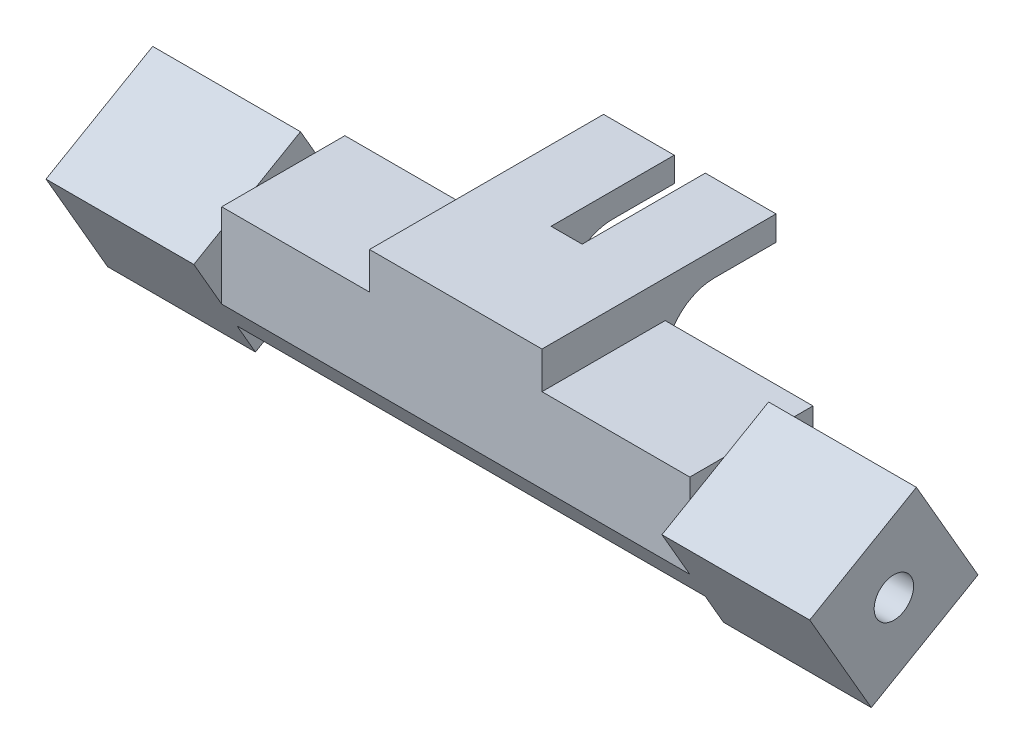
ISO-10303-21;
HEADER;
FILE_DESCRIPTION(('STEP AP214'),'2;1');
FILE_NAME('part.step','',(''),(''),'','','');
FILE_SCHEMA(('AUTOMOTIVE_DESIGN { 1 0 10303 214 1 1 1 1 }'));
ENDSEC;
DATA;
#1=APPLICATION_CONTEXT('core data for automotive mechanical design processes');
#2=APPLICATION_PROTOCOL_DEFINITION('international standard','automotive_design',2000,#1);
#3=PRODUCT_CONTEXT('',#1,'mechanical');
#4=PRODUCT('Part','Part','',(#3));
#5=PRODUCT_RELATED_PRODUCT_CATEGORY('part','',(#4));
#6=PRODUCT_DEFINITION_FORMATION('','',#4);
#7=PRODUCT_DEFINITION_CONTEXT('part definition',#1,'design');
#8=PRODUCT_DEFINITION('design','',#6,#7);
#9=PRODUCT_DEFINITION_SHAPE('','',#8);
#10=(LENGTH_UNIT() NAMED_UNIT(*) SI_UNIT(.MILLI.,.METRE.));
#11=(NAMED_UNIT(*) PLANE_ANGLE_UNIT() SI_UNIT($,.RADIAN.));
#12=(NAMED_UNIT(*) SI_UNIT($,.STERADIAN.) SOLID_ANGLE_UNIT());
#13=UNCERTAINTY_MEASURE_WITH_UNIT(LENGTH_MEASURE(1.E-05),#10,'distance_accuracy_value','');
#14=(GEOMETRIC_REPRESENTATION_CONTEXT(3) GLOBAL_UNCERTAINTY_ASSIGNED_CONTEXT((#13)) GLOBAL_UNIT_ASSIGNED_CONTEXT((#10,
#11,#12)) REPRESENTATION_CONTEXT('',''));
#15=CARTESIAN_POINT('',(0.,0.,0.));
#16=DIRECTION('',(0.,0.,1.));
#17=DIRECTION('',(1.,0.,0.));
#18=AXIS2_PLACEMENT_3D('',#15,#16,#17);
#19=CARTESIAN_POINT('',(9.5,-6.,0.));
#20=DIRECTION('',(-1.,0.,0.));
#21=DIRECTION('',(0.,0.,1.));
#22=AXIS2_PLACEMENT_3D('',#19,#20,#21);
#23=PLANE('',#22);
#24=DIRECTION('',(0.,-0.5,0.866025403784439));
#25=VECTOR('',#24,1.);
#26=CARTESIAN_POINT('',(9.5,-2.9599364905389,5.6315698604072));
#27=LINE('',#26,#25);
#28=CARTESIAN_POINT('',(9.5,-1.5,3.10288568297002));
#29=VERTEX_POINT('',#28);
#30=CARTESIAN_POINT('',(9.5,-2.30662432702594,4.5));
#31=VERTEX_POINT('',#30);
#32=EDGE_CURVE('E11',#29,#31,#27,.T.);
#33=ORIENTED_EDGE('',*,*,#32,.F.);
#34=DIRECTION('',(0.,0.,1.));
#35=VECTOR('',#34,1.);
#36=CARTESIAN_POINT('',(9.5,-1.5,0.));
#37=LINE('',#36,#35);
#38=CARTESIAN_POINT('',(9.5,-1.5,4.5));
#39=VERTEX_POINT('',#38);
#40=EDGE_CURVE('E352',#29,#39,#37,.T.);
#41=ORIENTED_EDGE('',*,*,#40,.T.);
#42=DIRECTION('',(0.,1.,0.));
#43=VECTOR('',#42,1.);
#44=CARTESIAN_POINT('',(9.5,-6.,4.5));
#45=LINE('',#44,#43);
#46=EDGE_CURVE('E58',#31,#39,#45,.T.);
#47=ORIENTED_EDGE('',*,*,#46,.F.);
#48=EDGE_LOOP('',(#33,#41,#47));
#49=FACE_BOUND('',#48,.T.);
#50=ADVANCED_FACE('F39',(#49),#23,.F.);
#51=DIRECTION('',(0.,0.866025403784439,0.5));
#52=VECTOR('',#51,1.);
#53=CARTESIAN_POINT('',(9.5,-0.459936490538902,1.30144284148501));
#54=LINE('',#53,#52);
#55=CARTESIAN_POINT('',(9.5,-3.58012701892219,-0.500000000000005));
#56=VERTEX_POINT('',#55);
#57=CARTESIAN_POINT('',(9.5,-1.5,0.700961894323335));
#58=VERTEX_POINT('',#57);
#59=EDGE_CURVE('E48',#56,#58,#54,.T.);
#60=ORIENTED_EDGE('',*,*,#59,.F.);
#61=DIRECTION('',(0.,1.,0.));
#62=VECTOR('',#61,1.);
#63=CARTESIAN_POINT('',(9.5,-6.,-0.500000000000002));
#64=LINE('',#63,#62);
#65=CARTESIAN_POINT('',(9.5,-1.5,-0.500000000000002));
#66=VERTEX_POINT('',#65);
#67=EDGE_CURVE('E372',#56,#66,#64,.T.);
#68=ORIENTED_EDGE('',*,*,#67,.T.);
#69=EDGE_CURVE('E353',#66,#58,#37,.T.);
#70=ORIENTED_EDGE('',*,*,#69,.T.);
#71=EDGE_LOOP('',(#60,#68,#70));
#72=FACE_BOUND('',#71,.T.);
#73=ADVANCED_FACE('F503',(#72),#23,.F.);
#74=CARTESIAN_POINT('',(-9.5,-6.,0.));
#75=DIRECTION('',(-1.,0.,0.));
#76=DIRECTION('',(0.,0.,1.));
#77=AXIS2_PLACEMENT_3D('',#74,#75,#76);
#78=PLANE('',#77);
#79=DIRECTION('',(0.,-0.866025403784439,-0.499999999999999));
#80=VECTOR('',#79,1.);
#81=CARTESIAN_POINT('',(-9.5,-4.79006350946111,-1.19855715851499));
#82=LINE('',#81,#80);
#83=CARTESIAN_POINT('',(-9.5,-1.5,0.700961894323343));
#84=VERTEX_POINT('',#83);
#85=CARTESIAN_POINT('',(-9.5,-3.5801270189222,-0.500000000000002));
#86=VERTEX_POINT('',#85);
#87=EDGE_CURVE('E291',#84,#86,#82,.T.);
#88=ORIENTED_EDGE('',*,*,#87,.F.);
#89=DIRECTION('',(0.,0.,1.));
#90=VECTOR('',#89,1.);
#91=CARTESIAN_POINT('',(-9.5,-1.5,0.));
#92=LINE('',#91,#90);
#93=CARTESIAN_POINT('',(-9.5,-1.5,-0.500000000000002));
#94=VERTEX_POINT('',#93);
#95=EDGE_CURVE('E336',#94,#84,#92,.T.);
#96=ORIENTED_EDGE('',*,*,#95,.F.);
#97=DIRECTION('',(0.,1.,0.));
#98=VECTOR('',#97,1.);
#99=CARTESIAN_POINT('',(-9.5,-6.,-0.500000000000002));
#100=LINE('',#99,#98);
#101=EDGE_CURVE('E264',#86,#94,#100,.T.);
#102=ORIENTED_EDGE('',*,*,#101,.F.);
#103=EDGE_LOOP('',(#88,#96,#102));
#104=FACE_BOUND('',#103,.T.);
#105=ADVANCED_FACE('F477',(#104),#78,.T.);
#106=DIRECTION('',(0.,0.499999999999999,-0.866025403784439));
#107=VECTOR('',#106,1.);
#108=CARTESIAN_POINT('',(-9.5,-0.459936490538908,1.30144284148501));
#109=LINE('',#108,#107);
#110=CARTESIAN_POINT('',(-9.5,-2.30662432702594,4.5));
#111=VERTEX_POINT('',#110);
#112=CARTESIAN_POINT('',(-9.5,-1.5,3.10288568297002));
#113=VERTEX_POINT('',#112);
#114=EDGE_CURVE('E286',#111,#113,#109,.T.);
#115=ORIENTED_EDGE('',*,*,#114,.F.);
#116=DIRECTION('',(0.,1.,0.));
#117=VECTOR('',#116,1.);
#118=CARTESIAN_POINT('',(-9.5,-6.,4.5));
#119=LINE('',#118,#117);
#120=CARTESIAN_POINT('',(-9.5,-1.5,4.5));
#121=VERTEX_POINT('',#120);
#122=EDGE_CURVE('E263',#111,#121,#119,.T.);
#123=ORIENTED_EDGE('',*,*,#122,.T.);
#124=EDGE_CURVE('E335',#113,#121,#92,.T.);
#125=ORIENTED_EDGE('',*,*,#124,.F.);
#126=EDGE_LOOP('',(#115,#123,#125));
#127=FACE_BOUND('',#126,.T.);
#128=ADVANCED_FACE('F448',(#127),#78,.T.);
#129=CARTESIAN_POINT('',(0.,-1.,-5.));
#130=DIRECTION('',(0.,0.,1.));
#131=DIRECTION('',(1.,0.,0.));
#132=AXIS2_PLACEMENT_3D('',#129,#130,#131);
#133=PLANE('',#132);
#134=DIRECTION('',(0.,1.,0.));
#135=VECTOR('',#134,1.);
#136=CARTESIAN_POINT('',(0.63,-1.3,-5.));
#137=LINE('',#136,#135);
#138=CARTESIAN_POINT('',(0.63,-1.,-5.));
#139=VERTEX_POINT('',#138);
#140=CARTESIAN_POINT('',(0.63,0.,-5.));
#141=VERTEX_POINT('',#140);
#142=EDGE_CURVE('E319',#139,#141,#137,.T.);
#143=ORIENTED_EDGE('',*,*,#142,.T.);
#144=DIRECTION('',(1.,0.,0.));
#145=VECTOR('',#144,1.);
#146=CARTESIAN_POINT('',(0.,0.,-5.));
#147=LINE('',#146,#145);
#148=CARTESIAN_POINT('',(3.5,0.,-5.));
#149=VERTEX_POINT('',#148);
#150=EDGE_CURVE('E383',#141,#149,#147,.T.);
#151=ORIENTED_EDGE('',*,*,#150,.T.);
#152=DIRECTION('',(0.,1.,0.));
#153=VECTOR('',#152,1.);
#154=CARTESIAN_POINT('',(3.5,-1.,-5.));
#155=LINE('',#154,#153);
#156=CARTESIAN_POINT('',(3.5,-1.,-5.));
#157=VERTEX_POINT('',#156);
#158=EDGE_CURVE('E405',#157,#149,#155,.T.);
#159=ORIENTED_EDGE('',*,*,#158,.F.);
#160=DIRECTION('',(1.,0.,0.));
#161=VECTOR('',#160,1.);
#162=CARTESIAN_POINT('',(0.,-1.,-5.));
#163=LINE('',#162,#161);
#164=EDGE_CURVE('E389',#139,#157,#163,.T.);
#165=ORIENTED_EDGE('',*,*,#164,.F.);
#166=EDGE_LOOP('',(#143,#151,#159,#165));
#167=FACE_BOUND('',#166,.T.);
#168=ADVANCED_FACE('F531',(#167),#133,.F.);
#169=CARTESIAN_POINT('',(0.,-1.,0.));
#170=DIRECTION('',(0.,1.,0.));
#171=DIRECTION('',(0.,0.,1.));
#172=AXIS2_PLACEMENT_3D('',#169,#170,#171);
#173=PLANE('',#172);
#174=DIRECTION('',(0.,0.,1.));
#175=VECTOR('',#174,1.);
#176=CARTESIAN_POINT('',(0.630000000000001,-1.,0.));
#177=LINE('',#176,#175);
#178=CARTESIAN_POINT('',(0.630000000000001,-1.,-2.5));
#179=VERTEX_POINT('',#178);
#180=EDGE_CURVE('E330',#139,#179,#177,.T.);
#181=ORIENTED_EDGE('',*,*,#180,.F.);
#182=ORIENTED_EDGE('',*,*,#164,.T.);
#183=DIRECTION('',(0.,0.,1.));
#184=VECTOR('',#183,1.);
#185=CARTESIAN_POINT('',(3.5,-1.,0.));
#186=LINE('',#185,#184);
#187=CARTESIAN_POINT('',(3.5,-1.,-2.5));
#188=VERTEX_POINT('',#187);
#189=EDGE_CURVE('E392',#157,#188,#186,.T.);
#190=ORIENTED_EDGE('',*,*,#189,.T.);
#191=DIRECTION('',(1.,0.,0.));
#192=VECTOR('',#191,1.);
#193=CARTESIAN_POINT('',(-3.5,-1.,-2.5));
#194=LINE('',#193,#192);
#195=EDGE_CURVE('E413',#188,#179,#194,.F.);
#196=ORIENTED_EDGE('',*,*,#195,.T.);
#197=EDGE_LOOP('',(#181,#182,#190,#196));
#198=FACE_BOUND('',#197,.T.);
#199=ADVANCED_FACE('F522',(#198),#173,.F.);
#200=CARTESIAN_POINT('',(0.,0.,0.));
#201=DIRECTION('',(0.,1.,0.));
#202=DIRECTION('',(0.,0.,1.));
#203=AXIS2_PLACEMENT_3D('',#200,#201,#202);
#204=PLANE('',#203);
#205=ORIENTED_EDGE('',*,*,#150,.F.);
#206=DIRECTION('',(0.,0.,1.));
#207=VECTOR('',#206,1.);
#208=CARTESIAN_POINT('',(0.630000000000001,0.,0.));
#209=LINE('',#208,#207);
#210=CARTESIAN_POINT('',(0.630000000000001,0.,0.));
#211=VERTEX_POINT('',#210);
#212=EDGE_CURVE('E306',#141,#211,#209,.T.);
#213=ORIENTED_EDGE('',*,*,#212,.T.);
#214=DIRECTION('',(-1.,0.,0.));
#215=VECTOR('',#214,1.);
#216=CARTESIAN_POINT('',(0.,0.,0.));
#217=LINE('',#216,#215);
#218=CARTESIAN_POINT('',(-0.63,0.,0.));
#219=VERTEX_POINT('',#218);
#220=EDGE_CURVE('E314',#211,#219,#217,.T.);
#221=ORIENTED_EDGE('',*,*,#220,.T.);
#222=DIRECTION('',(0.,0.,1.));
#223=VECTOR('',#222,1.);
#224=CARTESIAN_POINT('',(-0.63,0.,0.));
#225=LINE('',#224,#223);
#226=CARTESIAN_POINT('',(-0.630000000000001,0.,-5.));
#227=VERTEX_POINT('',#226);
#228=EDGE_CURVE('E302',#227,#219,#225,.T.);
#229=ORIENTED_EDGE('',*,*,#228,.F.);
#230=CARTESIAN_POINT('',(-3.5,0.,-5.));
#231=VERTEX_POINT('',#230);
#232=EDGE_CURVE('E396',#231,#227,#147,.T.);
#233=ORIENTED_EDGE('',*,*,#232,.F.);
#234=DIRECTION('',(0.,0.,1.));
#235=VECTOR('',#234,1.);
#236=CARTESIAN_POINT('',(-3.5,0.,0.));
#237=LINE('',#236,#235);
#238=CARTESIAN_POINT('',(-3.5,0.,4.5));
#239=VERTEX_POINT('',#238);
#240=EDGE_CURVE('E399',#231,#239,#237,.T.);
#241=ORIENTED_EDGE('',*,*,#240,.T.);
#242=DIRECTION('',(-1.,0.,0.));
#243=VECTOR('',#242,1.);
#244=CARTESIAN_POINT('',(0.,0.,4.5));
#245=LINE('',#244,#243);
#246=CARTESIAN_POINT('',(3.5,0.,4.5));
#247=VERTEX_POINT('',#246);
#248=EDGE_CURVE('E377',#247,#239,#245,.T.);
#249=ORIENTED_EDGE('',*,*,#248,.F.);
#250=DIRECTION('',(0.,0.,1.));
#251=VECTOR('',#250,1.);
#252=CARTESIAN_POINT('',(3.5,0.,0.));
#253=LINE('',#252,#251);
#254=EDGE_CURVE('E402',#149,#247,#253,.T.);
#255=ORIENTED_EDGE('',*,*,#254,.F.);
#256=EDGE_LOOP('',(#205,#213,#221,#229,#233,#241,#249,#255));
#257=FACE_BOUND('',#256,.T.);
#258=ADVANCED_FACE('F461',(#257),#204,.T.);
#259=CARTESIAN_POINT('',(0.,-3.,-2.5));
#260=DIRECTION('',(-1.,0.,0.));
#261=DIRECTION('',(0.,0.,1.));
#262=AXIS2_PLACEMENT_3D('',#259,#260,#261);
#263=CYLINDRICAL_SURFACE('',#262,2.);
#264=CARTESIAN_POINT('',(0.630000000000001,-3.,-2.5));
#265=DIRECTION('',(-1.,0.,0.));
#266=DIRECTION('',(0.,0.,1.));
#267=AXIS2_PLACEMENT_3D('',#264,#265,#266);
#268=CIRCLE('',#267,2.);
#269=CARTESIAN_POINT('',(0.630000000000001,-1.3,-1.44643462471473));
#270=VERTEX_POINT('',#269);
#271=EDGE_CURVE('E43',#179,#270,#268,.F.);
#272=ORIENTED_EDGE('',*,*,#271,.F.);
#273=ORIENTED_EDGE('',*,*,#195,.F.);
#274=CARTESIAN_POINT('',(3.5,-3.,-2.5));
#275=DIRECTION('',(-1.,0.,0.));
#276=DIRECTION('',(0.,0.,1.));
#277=AXIS2_PLACEMENT_3D('',#274,#275,#276);
#278=CIRCLE('',#277,2.);
#279=CARTESIAN_POINT('',(3.5,-3.,-0.5));
#280=VERTEX_POINT('',#279);
#281=EDGE_CURVE('E416',#280,#188,#278,.T.);
#282=ORIENTED_EDGE('',*,*,#281,.F.);
#283=DIRECTION('',(1.,0.,0.));
#284=VECTOR('',#283,1.);
#285=CARTESIAN_POINT('',(3.5,-3.,-0.5));
#286=LINE('',#285,#284);
#287=CARTESIAN_POINT('',(-3.5,-3.,-0.5));
#288=VERTEX_POINT('',#287);
#289=EDGE_CURVE('E408',#288,#280,#286,.T.);
#290=ORIENTED_EDGE('',*,*,#289,.F.);
#291=CARTESIAN_POINT('',(-3.5,-3.,-2.5));
#292=DIRECTION('',(-1.,0.,0.));
#293=DIRECTION('',(0.,0.,1.));
#294=AXIS2_PLACEMENT_3D('',#291,#292,#293);
#295=CIRCLE('',#294,2.);
#296=CARTESIAN_POINT('',(-3.5,-1.,-2.5));
#297=VERTEX_POINT('',#296);
#298=EDGE_CURVE('E418',#297,#288,#295,.F.);
#299=ORIENTED_EDGE('',*,*,#298,.F.);
#300=CARTESIAN_POINT('',(-0.630000000000001,-1.,-2.5));
#301=VERTEX_POINT('',#300);
#302=EDGE_CURVE('E412',#301,#297,#194,.F.);
#303=ORIENTED_EDGE('',*,*,#302,.F.);
#304=CARTESIAN_POINT('',(-0.630000000000001,-3.,-2.5));
#305=DIRECTION('',(-1.,0.,0.));
#306=DIRECTION('',(0.,0.,1.));
#307=AXIS2_PLACEMENT_3D('',#304,#305,#306);
#308=CIRCLE('',#307,2.);
#309=CARTESIAN_POINT('',(-0.630000000000001,-1.3,-1.44643462471473));
#310=VERTEX_POINT('',#309);
#311=EDGE_CURVE('E421',#301,#310,#308,.F.);
#312=ORIENTED_EDGE('',*,*,#311,.T.);
#313=DIRECTION('',(-1.,0.,0.));
#314=VECTOR('',#313,1.);
#315=CARTESIAN_POINT('',(0.,-1.3,-1.44643462471473));
#316=LINE('',#315,#314);
#317=EDGE_CURVE('E420',#270,#310,#316,.T.);
#318=ORIENTED_EDGE('',*,*,#317,.F.);
#319=EDGE_LOOP('',(#272,#273,#282,#290,#299,#303,#312,#318));
#320=FACE_BOUND('',#319,.T.);
#321=ADVANCED_FACE('F41',(#320),#263,.F.);
#322=ORIENTED_EDGE('',*,*,#232,.T.);
#323=DIRECTION('',(0.,1.,0.));
#324=VECTOR('',#323,1.);
#325=CARTESIAN_POINT('',(-0.630000000000001,-1.3,-5.));
#326=LINE('',#325,#324);
#327=CARTESIAN_POINT('',(-0.630000000000001,-1.,-5.));
#328=VERTEX_POINT('',#327);
#329=EDGE_CURVE('E311',#328,#227,#326,.T.);
#330=ORIENTED_EDGE('',*,*,#329,.F.);
#331=CARTESIAN_POINT('',(-3.5,-1.,-5.));
#332=VERTEX_POINT('',#331);
#333=EDGE_CURVE('E385',#332,#328,#163,.T.);
#334=ORIENTED_EDGE('',*,*,#333,.F.);
#335=DIRECTION('',(0.,1.,0.));
#336=VECTOR('',#335,1.);
#337=CARTESIAN_POINT('',(-3.5,-1.,-5.));
#338=LINE('',#337,#336);
#339=EDGE_CURVE('E395',#332,#231,#338,.T.);
#340=ORIENTED_EDGE('',*,*,#339,.T.);
#341=EDGE_LOOP('',(#322,#330,#334,#340));
#342=FACE_BOUND('',#341,.T.);
#343=ADVANCED_FACE('F466',(#342),#133,.F.);
#344=CARTESIAN_POINT('',(3.5,-1.,0.));
#345=DIRECTION('',(-1.,0.,0.));
#346=DIRECTION('',(0.,0.,1.));
#347=AXIS2_PLACEMENT_3D('',#344,#345,#346);
#348=PLANE('',#347);
#349=DIRECTION('',(0.,0.,1.));
#350=VECTOR('',#349,1.);
#351=CARTESIAN_POINT('',(3.5,-1.5,0.));
#352=LINE('',#351,#350);
#353=CARTESIAN_POINT('',(3.5,-1.5,-0.5));
#354=VERTEX_POINT('',#353);
#355=CARTESIAN_POINT('',(3.5,-1.5,4.5));
#356=VERTEX_POINT('',#355);
#357=EDGE_CURVE('E360',#354,#356,#352,.T.);
#358=ORIENTED_EDGE('',*,*,#357,.F.);
#359=DIRECTION('',(0.,-1.,0.));
#360=VECTOR('',#359,1.);
#361=CARTESIAN_POINT('',(3.5,-1.5,-0.5));
#362=LINE('',#361,#360);
#363=EDGE_CURVE('E362',#354,#280,#362,.T.);
#364=ORIENTED_EDGE('',*,*,#363,.T.);
#365=ORIENTED_EDGE('',*,*,#281,.T.);
#366=ORIENTED_EDGE('',*,*,#189,.F.);
#367=ORIENTED_EDGE('',*,*,#158,.T.);
#368=ORIENTED_EDGE('',*,*,#254,.T.);
#369=DIRECTION('',(0.,1.,0.));
#370=VECTOR('',#369,1.);
#371=CARTESIAN_POINT('',(3.5,-4.,4.5));
#372=LINE('',#371,#370);
#373=EDGE_CURVE('E381',#356,#247,#372,.T.);
#374=ORIENTED_EDGE('',*,*,#373,.F.);
#375=EDGE_LOOP('',(#358,#364,#365,#366,#367,#368,#374));
#376=FACE_BOUND('',#375,.T.);
#377=ADVANCED_FACE('F525',(#376),#348,.F.);
#378=CARTESIAN_POINT('',(-3.5,-1.,0.));
#379=DIRECTION('',(-1.,0.,0.));
#380=DIRECTION('',(0.,0.,1.));
#381=AXIS2_PLACEMENT_3D('',#378,#379,#380);
#382=PLANE('',#381);
#383=DIRECTION('',(0.,-1.,0.));
#384=VECTOR('',#383,1.);
#385=CARTESIAN_POINT('',(-3.5,-1.5,-0.5));
#386=LINE('',#385,#384);
#387=CARTESIAN_POINT('',(-3.5,-1.5,-0.500000000000002));
#388=VERTEX_POINT('',#387);
#389=EDGE_CURVE('E346',#388,#288,#386,.T.);
#390=ORIENTED_EDGE('',*,*,#389,.F.);
#391=DIRECTION('',(0.,0.,-1.));
#392=VECTOR('',#391,1.);
#393=CARTESIAN_POINT('',(-3.5,-1.5,0.));
#394=LINE('',#393,#392);
#395=CARTESIAN_POINT('',(-3.5,-1.5,4.5));
#396=VERTEX_POINT('',#395);
#397=EDGE_CURVE('E343',#396,#388,#394,.T.);
#398=ORIENTED_EDGE('',*,*,#397,.F.);
#399=DIRECTION('',(0.,1.,0.));
#400=VECTOR('',#399,1.);
#401=CARTESIAN_POINT('',(-3.5,-4.,4.5));
#402=LINE('',#401,#400);
#403=EDGE_CURVE('E380',#396,#239,#402,.T.);
#404=ORIENTED_EDGE('',*,*,#403,.T.);
#405=ORIENTED_EDGE('',*,*,#240,.F.);
#406=ORIENTED_EDGE('',*,*,#339,.F.);
#407=DIRECTION('',(0.,0.,1.));
#408=VECTOR('',#407,1.);
#409=CARTESIAN_POINT('',(-3.5,-1.,0.));
#410=LINE('',#409,#408);
#411=EDGE_CURVE('E388',#332,#297,#410,.T.);
#412=ORIENTED_EDGE('',*,*,#411,.T.);
#413=ORIENTED_EDGE('',*,*,#298,.T.);
#414=EDGE_LOOP('',(#390,#398,#404,#405,#406,#412,#413));
#415=FACE_BOUND('',#414,.T.);
#416=ADVANCED_FACE('F457',(#415),#382,.T.);
#417=ORIENTED_EDGE('',*,*,#333,.T.);
#418=DIRECTION('',(0.,0.,1.));
#419=VECTOR('',#418,1.);
#420=CARTESIAN_POINT('',(-0.63,-1.,0.));
#421=LINE('',#420,#419);
#422=EDGE_CURVE('E322',#328,#301,#421,.T.);
#423=ORIENTED_EDGE('',*,*,#422,.T.);
#424=ORIENTED_EDGE('',*,*,#302,.T.);
#425=ORIENTED_EDGE('',*,*,#411,.F.);
#426=EDGE_LOOP('',(#417,#423,#424,#425));
#427=FACE_BOUND('',#426,.T.);
#428=ADVANCED_FACE('F519',(#427),#173,.F.);
#429=CARTESIAN_POINT('',(0.,-4.,-0.5));
#430=DIRECTION('',(0.,0.,1.));
#431=DIRECTION('',(1.,0.,0.));
#432=AXIS2_PLACEMENT_3D('',#429,#430,#431);
#433=PLANE('',#432);
#434=CARTESIAN_POINT('',(9.5,-5.19337567297407,-0.500000000000002));
#435=VERTEX_POINT('',#434);
#436=EDGE_CURVE('E250',#435,#56,#64,.T.);
#437=ORIENTED_EDGE('',*,*,#436,.F.);
#438=DIRECTION('',(-1.,0.,0.));
#439=VECTOR('',#438,1.);
#440=CARTESIAN_POINT('',(15.5,-5.19337567297407,-0.500000000000002));
#441=LINE('',#440,#439);
#442=CARTESIAN_POINT('',(-9.5,-5.19337567297407,-0.500000000000002));
#443=VERTEX_POINT('',#442);
#444=EDGE_CURVE('E243',#435,#443,#441,.T.);
#445=ORIENTED_EDGE('',*,*,#444,.T.);
#446=EDGE_CURVE('E246',#443,#86,#100,.T.);
#447=ORIENTED_EDGE('',*,*,#446,.T.);
#448=ORIENTED_EDGE('',*,*,#101,.T.);
#449=DIRECTION('',(1.,0.,0.));
#450=VECTOR('',#449,1.);
#451=CARTESIAN_POINT('',(0.,-1.5,-0.500000000000002));
#452=LINE('',#451,#450);
#453=EDGE_CURVE('E339',#94,#388,#452,.T.);
#454=ORIENTED_EDGE('',*,*,#453,.T.);
#455=ORIENTED_EDGE('',*,*,#389,.T.);
#456=ORIENTED_EDGE('',*,*,#289,.T.);
#457=ORIENTED_EDGE('',*,*,#363,.F.);
#458=DIRECTION('',(1.,0.,0.));
#459=VECTOR('',#458,1.);
#460=CARTESIAN_POINT('',(0.,-1.5,-0.500000000000002));
#461=LINE('',#460,#459);
#462=EDGE_CURVE('E349',#354,#66,#461,.T.);
#463=ORIENTED_EDGE('',*,*,#462,.T.);
#464=ORIENTED_EDGE('',*,*,#67,.F.);
#465=EDGE_LOOP('',(#437,#445,#447,#448,#454,#455,#456,#457,#463,#464));
#466=FACE_BOUND('',#465,.T.);
#467=ADVANCED_FACE('F245',(#466),#433,.F.);
#468=CARTESIAN_POINT('',(0.,-4.,4.5));
#469=DIRECTION('',(0.,0.,-1.));
#470=DIRECTION('',(-1.,0.,0.));
#471=AXIS2_PLACEMENT_3D('',#468,#469,#470);
#472=PLANE('',#471);
#473=CARTESIAN_POINT('',(-9.5,-4.91987298107782,4.5));
#474=VERTEX_POINT('',#473);
#475=EDGE_CURVE('E376',#474,#111,#119,.T.);
#476=ORIENTED_EDGE('',*,*,#475,.F.);
#477=DIRECTION('',(-1.,0.,0.));
#478=VECTOR('',#477,1.);
#479=CARTESIAN_POINT('',(15.5,-4.91987298107782,4.5));
#480=LINE('',#479,#478);
#481=CARTESIAN_POINT('',(9.5,-4.91987298107782,4.5));
#482=VERTEX_POINT('',#481);
#483=EDGE_CURVE('E643',#482,#474,#480,.T.);
#484=ORIENTED_EDGE('',*,*,#483,.F.);
#485=EDGE_CURVE('E371',#482,#31,#45,.T.);
#486=ORIENTED_EDGE('',*,*,#485,.T.);
#487=ORIENTED_EDGE('',*,*,#46,.T.);
#488=DIRECTION('',(1.,0.,0.));
#489=VECTOR('',#488,1.);
#490=CARTESIAN_POINT('',(0.,-1.5,4.5));
#491=LINE('',#490,#489);
#492=EDGE_CURVE('E356',#356,#39,#491,.T.);
#493=ORIENTED_EDGE('',*,*,#492,.F.);
#494=ORIENTED_EDGE('',*,*,#373,.T.);
#495=ORIENTED_EDGE('',*,*,#248,.T.);
#496=ORIENTED_EDGE('',*,*,#403,.F.);
#497=DIRECTION('',(1.,0.,0.));
#498=VECTOR('',#497,1.);
#499=CARTESIAN_POINT('',(0.,-1.5,4.5));
#500=LINE('',#499,#498);
#501=EDGE_CURVE('E332',#121,#396,#500,.T.);
#502=ORIENTED_EDGE('',*,*,#501,.F.);
#503=ORIENTED_EDGE('',*,*,#122,.F.);
#504=EDGE_LOOP('',(#476,#484,#486,#487,#493,#494,#495,#496,#502,#503));
#505=FACE_BOUND('',#504,.T.);
#506=ADVANCED_FACE('F453',(#505),#472,.F.);
#507=CARTESIAN_POINT('',(0.,-6.,0.));
#508=DIRECTION('',(0.,-1.,0.));
#509=DIRECTION('',(0.,0.,-1.));
#510=AXIS2_PLACEMENT_3D('',#507,#508,#509);
#511=PLANE('',#510);
#512=DIRECTION('',(-1.,0.,0.));
#513=VECTOR('',#512,1.);
#514=CARTESIAN_POINT('',(15.5,-6.,0.897114317029961));
#515=LINE('',#514,#513);
#516=CARTESIAN_POINT('',(9.5,-6.,0.897114317029961));
#517=VERTEX_POINT('',#516);
#518=CARTESIAN_POINT('',(-9.5,-6.,0.897114317029961));
#519=VERTEX_POINT('',#518);
#520=EDGE_CURVE('E254',#517,#519,#515,.T.);
#521=ORIENTED_EDGE('',*,*,#520,.F.);
#522=DIRECTION('',(0.,0.,1.));
#523=VECTOR('',#522,1.);
#524=CARTESIAN_POINT('',(9.5,-6.,0.));
#525=LINE('',#524,#523);
#526=CARTESIAN_POINT('',(9.5,-6.,3.87638837486629));
#527=VERTEX_POINT('',#526);
#528=EDGE_CURVE('E367',#517,#527,#525,.T.);
#529=ORIENTED_EDGE('',*,*,#528,.T.);
#530=DIRECTION('',(-1.,0.,0.));
#531=VECTOR('',#530,1.);
#532=CARTESIAN_POINT('',(15.5,-6.,3.87638837486629));
#533=LINE('',#532,#531);
#534=CARTESIAN_POINT('',(-9.5,-6.,3.87638837486629));
#535=VERTEX_POINT('',#534);
#536=EDGE_CURVE('E255',#527,#535,#533,.T.);
#537=ORIENTED_EDGE('',*,*,#536,.T.);
#538=DIRECTION('',(0.,0.,1.));
#539=VECTOR('',#538,1.);
#540=CARTESIAN_POINT('',(-9.5,-6.,0.));
#541=LINE('',#540,#539);
#542=EDGE_CURVE('E364',#519,#535,#541,.T.);
#543=ORIENTED_EDGE('',*,*,#542,.F.);
#544=EDGE_LOOP('',(#521,#529,#537,#543));
#545=FACE_BOUND('',#544,.T.);
#546=ADVANCED_FACE('F511',(#545),#511,.T.);
#547=CARTESIAN_POINT('',(0.,-1.5,0.));
#548=DIRECTION('',(0.,-1.,0.));
#549=DIRECTION('',(0.,0.,-1.));
#550=AXIS2_PLACEMENT_3D('',#547,#548,#549);
#551=PLANE('',#550);
#552=ORIENTED_EDGE('',*,*,#462,.F.);
#553=ORIENTED_EDGE('',*,*,#357,.T.);
#554=ORIENTED_EDGE('',*,*,#492,.T.);
#555=ORIENTED_EDGE('',*,*,#40,.F.);
#556=EDGE_CURVE('E357',#58,#29,#37,.T.);
#557=ORIENTED_EDGE('',*,*,#556,.F.);
#558=ORIENTED_EDGE('',*,*,#69,.F.);
#559=EDGE_LOOP('',(#552,#553,#554,#555,#557,#558));
#560=FACE_BOUND('',#559,.T.);
#561=ADVANCED_FACE('F567',(#560),#551,.F.);
#562=CARTESIAN_POINT('',(0.,-1.5,0.));
#563=DIRECTION('',(0.,-1.,0.));
#564=DIRECTION('',(0.,0.,-1.));
#565=AXIS2_PLACEMENT_3D('',#562,#563,#564);
#566=PLANE('',#565);
#567=ORIENTED_EDGE('',*,*,#501,.T.);
#568=ORIENTED_EDGE('',*,*,#397,.T.);
#569=ORIENTED_EDGE('',*,*,#453,.F.);
#570=ORIENTED_EDGE('',*,*,#95,.T.);
#571=EDGE_CURVE('E340',#84,#113,#92,.T.);
#572=ORIENTED_EDGE('',*,*,#571,.T.);
#573=ORIENTED_EDGE('',*,*,#124,.T.);
#574=EDGE_LOOP('',(#567,#568,#569,#570,#572,#573));
#575=FACE_BOUND('',#574,.T.);
#576=ADVANCED_FACE('F444',(#575),#566,.F.);
#577=CARTESIAN_POINT('',(0.630000000000001,-1.3,0.));
#578=DIRECTION('',(-1.,0.,0.));
#579=DIRECTION('',(0.,0.,1.));
#580=AXIS2_PLACEMENT_3D('',#577,#578,#579);
#581=PLANE('',#580);
#582=ORIENTED_EDGE('',*,*,#180,.T.);
#583=ORIENTED_EDGE('',*,*,#271,.T.);
#584=DIRECTION('',(0.,0.,1.));
#585=VECTOR('',#584,1.);
#586=CARTESIAN_POINT('',(0.630000000000001,-1.3,0.));
#587=LINE('',#586,#585);
#588=CARTESIAN_POINT('',(0.630000000000001,-1.3,0.));
#589=VERTEX_POINT('',#588);
#590=EDGE_CURVE('E309',#270,#589,#587,.T.);
#591=ORIENTED_EDGE('',*,*,#590,.T.);
#592=DIRECTION('',(0.,1.,0.));
#593=VECTOR('',#592,1.);
#594=CARTESIAN_POINT('',(0.630000000000001,-1.3,0.));
#595=LINE('',#594,#593);
#596=EDGE_CURVE('E323',#589,#211,#595,.T.);
#597=ORIENTED_EDGE('',*,*,#596,.T.);
#598=ORIENTED_EDGE('',*,*,#212,.F.);
#599=ORIENTED_EDGE('',*,*,#142,.F.);
#600=EDGE_LOOP('',(#582,#583,#591,#597,#598,#599));
#601=FACE_BOUND('',#600,.T.);
#602=ADVANCED_FACE('F559',(#601),#581,.T.);
#603=CARTESIAN_POINT('',(-0.63,-1.3,0.));
#604=DIRECTION('',(-1.,0.,0.));
#605=DIRECTION('',(0.,0.,1.));
#606=AXIS2_PLACEMENT_3D('',#603,#604,#605);
#607=PLANE('',#606);
#608=ORIENTED_EDGE('',*,*,#329,.T.);
#609=ORIENTED_EDGE('',*,*,#228,.T.);
#610=DIRECTION('',(0.,1.,0.));
#611=VECTOR('',#610,1.);
#612=CARTESIAN_POINT('',(-0.63,-1.3,0.));
#613=LINE('',#612,#611);
#614=CARTESIAN_POINT('',(-0.63,-1.3,0.));
#615=VERTEX_POINT('',#614);
#616=EDGE_CURVE('E325',#615,#219,#613,.T.);
#617=ORIENTED_EDGE('',*,*,#616,.F.);
#618=DIRECTION('',(0.,0.,1.));
#619=VECTOR('',#618,1.);
#620=CARTESIAN_POINT('',(-0.63,-1.3,0.));
#621=LINE('',#620,#619);
#622=EDGE_CURVE('E303',#310,#615,#621,.T.);
#623=ORIENTED_EDGE('',*,*,#622,.F.);
#624=ORIENTED_EDGE('',*,*,#311,.F.);
#625=ORIENTED_EDGE('',*,*,#422,.F.);
#626=EDGE_LOOP('',(#608,#609,#617,#623,#624,#625));
#627=FACE_BOUND('',#626,.T.);
#628=ADVANCED_FACE('F554',(#627),#607,.F.);
#629=CARTESIAN_POINT('',(0.,-1.3,0.));
#630=DIRECTION('',(0.,1.,0.));
#631=DIRECTION('',(0.,0.,1.));
#632=AXIS2_PLACEMENT_3D('',#629,#630,#631);
#633=PLANE('',#632);
#634=ORIENTED_EDGE('',*,*,#317,.T.);
#635=ORIENTED_EDGE('',*,*,#622,.T.);
#636=DIRECTION('',(-1.,0.,0.));
#637=VECTOR('',#636,1.);
#638=CARTESIAN_POINT('',(0.,-1.3,0.));
#639=LINE('',#638,#637);
#640=EDGE_CURVE('E305',#589,#615,#639,.T.);
#641=ORIENTED_EDGE('',*,*,#640,.F.);
#642=ORIENTED_EDGE('',*,*,#590,.F.);
#643=EDGE_LOOP('',(#634,#635,#641,#642));
#644=FACE_BOUND('',#643,.T.);
#645=ADVANCED_FACE('F550',(#644),#633,.T.);
#646=CARTESIAN_POINT('',(0.,-1.3,0.));
#647=DIRECTION('',(0.,0.,-1.));
#648=DIRECTION('',(-1.,0.,0.));
#649=AXIS2_PLACEMENT_3D('',#646,#647,#648);
#650=PLANE('',#649);
#651=ORIENTED_EDGE('',*,*,#220,.F.);
#652=ORIENTED_EDGE('',*,*,#596,.F.);
#653=ORIENTED_EDGE('',*,*,#640,.T.);
#654=ORIENTED_EDGE('',*,*,#616,.T.);
#655=EDGE_LOOP('',(#651,#652,#653,#654));
#656=FACE_BOUND('',#655,.T.);
#657=ADVANCED_FACE('F557',(#656),#650,.T.);
#658=CARTESIAN_POINT('',(-9.5,0.,0.));
#659=DIRECTION('',(-1.,0.,0.));
#660=DIRECTION('',(0.,0.,1.));
#661=AXIS2_PLACEMENT_3D('',#658,#659,#660);
#662=PLANE('',#661);
#663=DIRECTION('',(0.,0.866025403784439,0.5));
#664=VECTOR('',#663,1.);
#665=CARTESIAN_POINT('',(-9.5,-7.29006350946111,3.13156986040721));
#666=LINE('',#665,#664);
#667=CARTESIAN_POINT('',(-9.5,-2.95993649053891,5.63156986040721));
#668=VERTEX_POINT('',#667);
#669=EDGE_CURVE('E271',#474,#668,#666,.T.);
#670=ORIENTED_EDGE('',*,*,#669,.F.);
#671=ORIENTED_EDGE('',*,*,#475,.T.);
#672=EDGE_CURVE('E283',#668,#111,#109,.T.);
#673=ORIENTED_EDGE('',*,*,#672,.F.);
#674=EDGE_LOOP('',(#670,#671,#673));
#675=FACE_BOUND('',#674,.T.);
#676=ADVANCED_FACE('F497',(#675),#662,.F.);
#677=ORIENTED_EDGE('',*,*,#571,.F.);
#678=CARTESIAN_POINT('',(-9.5,-0.459936490538908,1.30144284148501));
#679=VERTEX_POINT('',#678);
#680=EDGE_CURVE('E287',#679,#84,#82,.T.);
#681=ORIENTED_EDGE('',*,*,#680,.F.);
#682=EDGE_CURVE('E282',#113,#679,#109,.T.);
#683=ORIENTED_EDGE('',*,*,#682,.F.);
#684=EDGE_LOOP('',(#677,#681,#683));
#685=FACE_BOUND('',#684,.T.);
#686=ADVANCED_FACE('F441',(#685),#662,.F.);
#687=DIRECTION('',(0.,-0.5,0.866025403784439));
#688=VECTOR('',#687,1.);
#689=CARTESIAN_POINT('',(-9.5,-4.79006350946111,-1.19855715851499));
#690=LINE('',#689,#688);
#691=CARTESIAN_POINT('',(-9.5,-7.29006350946111,3.13156986040721));
#692=VERTEX_POINT('',#691);
#693=EDGE_CURVE('E272',#519,#692,#690,.T.);
#694=ORIENTED_EDGE('',*,*,#693,.F.);
#695=ORIENTED_EDGE('',*,*,#542,.T.);
#696=EDGE_CURVE('E274',#692,#535,#666,.T.);
#697=ORIENTED_EDGE('',*,*,#696,.F.);
#698=EDGE_LOOP('',(#694,#695,#697));
#699=FACE_BOUND('',#698,.T.);
#700=ADVANCED_FACE('F498',(#699),#662,.F.);
#701=CARTESIAN_POINT('',(-15.5,-4.79006350946111,-1.19855715851499));
#702=DIRECTION('',(0.,0.866025403784439,0.5));
#703=DIRECTION('',(0.,-0.5,0.866025403784439));
#704=AXIS2_PLACEMENT_3D('',#701,#702,#703);
#705=PLANE('',#704);
#706=CARTESIAN_POINT('',(-9.5,-4.79006350946111,-1.19855715851499));
#707=VERTEX_POINT('',#706);
#708=EDGE_CURVE('E260',#707,#443,#690,.T.);
#709=ORIENTED_EDGE('',*,*,#708,.T.);
#710=ORIENTED_EDGE('',*,*,#444,.F.);
#711=DIRECTION('',(0.,0.5,-0.866025403784439));
#712=VECTOR('',#711,1.);
#713=CARTESIAN_POINT('',(9.5,-7.2900635094611,3.1315698604072));
#714=LINE('',#713,#712);
#715=CARTESIAN_POINT('',(9.5,-4.7900635094611,-1.19855715851499));
#716=VERTEX_POINT('',#715);
#717=EDGE_CURVE('E631',#435,#716,#714,.T.);
#718=ORIENTED_EDGE('',*,*,#717,.T.);
#719=DIRECTION('',(-1.,0.,0.));
#720=VECTOR('',#719,1.);
#721=CARTESIAN_POINT('',(15.5,-4.7900635094611,-1.19855715851499));
#722=LINE('',#721,#720);
#723=CARTESIAN_POINT('',(15.5,-4.7900635094611,-1.19855715851499));
#724=VERTEX_POINT('',#723);
#725=EDGE_CURVE('E607',#724,#716,#722,.T.);
#726=ORIENTED_EDGE('',*,*,#725,.F.);
#727=DIRECTION('',(0.,0.5,-0.866025403784439));
#728=VECTOR('',#727,1.);
#729=CARTESIAN_POINT('',(15.5,-7.2900635094611,3.1315698604072));
#730=LINE('',#729,#728);
#731=CARTESIAN_POINT('',(15.5,-7.2900635094611,3.1315698604072));
#732=VERTEX_POINT('',#731);
#733=EDGE_CURVE('E597',#732,#724,#730,.T.);
#734=ORIENTED_EDGE('',*,*,#733,.F.);
#735=DIRECTION('',(-1.,0.,0.));
#736=VECTOR('',#735,1.);
#737=CARTESIAN_POINT('',(15.5,-7.2900635094611,3.1315698604072));
#738=LINE('',#737,#736);
#739=CARTESIAN_POINT('',(9.5,-7.2900635094611,3.1315698604072));
#740=VERTEX_POINT('',#739);
#741=EDGE_CURVE('E276',#732,#740,#738,.T.);
#742=ORIENTED_EDGE('',*,*,#741,.T.);
#743=EDGE_CURVE('E619',#740,#517,#714,.T.);
#744=ORIENTED_EDGE('',*,*,#743,.T.);
#745=ORIENTED_EDGE('',*,*,#520,.T.);
#746=ORIENTED_EDGE('',*,*,#693,.T.);
#747=DIRECTION('',(1.,0.,0.));
#748=VECTOR('',#747,1.);
#749=CARTESIAN_POINT('',(-15.5,-7.29006350946111,3.13156986040721));
#750=LINE('',#749,#748);
#751=CARTESIAN_POINT('',(-15.5,-7.29006350946111,3.13156986040721));
#752=VERTEX_POINT('',#751);
#753=EDGE_CURVE('E299',#752,#692,#750,.T.);
#754=ORIENTED_EDGE('',*,*,#753,.F.);
#755=DIRECTION('',(0.,-0.5,0.866025403784439));
#756=VECTOR('',#755,1.);
#757=CARTESIAN_POINT('',(-15.5,-4.79006350946111,-1.19855715851499));
#758=LINE('',#757,#756);
#759=CARTESIAN_POINT('',(-15.5,-4.79006350946111,-1.19855715851499));
#760=VERTEX_POINT('',#759);
#761=EDGE_CURVE('E290',#760,#752,#758,.T.);
#762=ORIENTED_EDGE('',*,*,#761,.F.);
#763=DIRECTION('',(1.,0.,0.));
#764=VECTOR('',#763,1.);
#765=CARTESIAN_POINT('',(-15.5,-4.79006350946111,-1.19855715851499));
#766=LINE('',#765,#764);
#767=EDGE_CURVE('E270',#760,#707,#766,.T.);
#768=ORIENTED_EDGE('',*,*,#767,.T.);
#769=EDGE_LOOP('',(#709,#710,#718,#726,#734,#742,#744,#745,#746,#754,#762,#768));
#770=FACE_BOUND('',#769,.T.);
#771=ADVANCED_FACE('F267',(#770),#705,.F.);
#772=CARTESIAN_POINT('',(-15.5,-7.29006350946111,3.13156986040721));
#773=DIRECTION('',(0.,0.5,-0.866025403784439));
#774=DIRECTION('',(0.,0.866025403784439,0.5));
#775=AXIS2_PLACEMENT_3D('',#772,#773,#774);
#776=PLANE('',#775);
#777=ORIENTED_EDGE('',*,*,#696,.T.);
#778=ORIENTED_EDGE('',*,*,#536,.F.);
#779=DIRECTION('',(0.,-0.866025403784439,-0.5));
#780=VECTOR('',#779,1.);
#781=CARTESIAN_POINT('',(9.5,-2.9599364905389,5.6315698604072));
#782=LINE('',#781,#780);
#783=EDGE_CURVE('E624',#527,#740,#782,.T.);
#784=ORIENTED_EDGE('',*,*,#783,.T.);
#785=ORIENTED_EDGE('',*,*,#741,.F.);
#786=DIRECTION('',(0.,-0.866025403784439,-0.5));
#787=VECTOR('',#786,1.);
#788=CARTESIAN_POINT('',(15.5,-2.9599364905389,5.6315698604072));
#789=LINE('',#788,#787);
#790=CARTESIAN_POINT('',(15.5,-2.9599364905389,5.6315698604072));
#791=VERTEX_POINT('',#790);
#792=EDGE_CURVE('E596',#791,#732,#789,.T.);
#793=ORIENTED_EDGE('',*,*,#792,.F.);
#794=DIRECTION('',(-1.,0.,0.));
#795=VECTOR('',#794,1.);
#796=CARTESIAN_POINT('',(15.5,-2.9599364905389,5.6315698604072));
#797=LINE('',#796,#795);
#798=CARTESIAN_POINT('',(9.5,-2.9599364905389,5.6315698604072));
#799=VERTEX_POINT('',#798);
#800=EDGE_CURVE('E603',#791,#799,#797,.T.);
#801=ORIENTED_EDGE('',*,*,#800,.T.);
#802=EDGE_CURVE('E627',#799,#482,#782,.T.);
#803=ORIENTED_EDGE('',*,*,#802,.T.);
#804=ORIENTED_EDGE('',*,*,#483,.T.);
#805=ORIENTED_EDGE('',*,*,#669,.T.);
#806=DIRECTION('',(1.,0.,0.));
#807=VECTOR('',#806,1.);
#808=CARTESIAN_POINT('',(-15.5,-2.95993649053891,5.63156986040721));
#809=LINE('',#808,#807);
#810=CARTESIAN_POINT('',(-15.5,-2.95993649053891,5.63156986040721));
#811=VERTEX_POINT('',#810);
#812=EDGE_CURVE('E296',#811,#668,#809,.T.);
#813=ORIENTED_EDGE('',*,*,#812,.F.);
#814=DIRECTION('',(0.,0.866025403784439,0.5));
#815=VECTOR('',#814,1.);
#816=CARTESIAN_POINT('',(-15.5,-7.29006350946111,3.13156986040721));
#817=LINE('',#816,#815);
#818=EDGE_CURVE('E481',#752,#811,#817,.T.);
#819=ORIENTED_EDGE('',*,*,#818,.F.);
#820=ORIENTED_EDGE('',*,*,#753,.T.);
#821=EDGE_LOOP('',(#777,#778,#784,#785,#793,#801,#803,#804,#805,#813,#819,#820));
#822=FACE_BOUND('',#821,.T.);
#823=ADVANCED_FACE('F622',(#822),#776,.F.);
#824=CARTESIAN_POINT('',(-15.5,-0.459936490538908,1.30144284148501));
#825=DIRECTION('',(0.,-0.866025403784439,-0.499999999999999));
#826=DIRECTION('',(0.,0.499999999999999,-0.866025403784439));
#827=AXIS2_PLACEMENT_3D('',#824,#825,#826);
#828=PLANE('',#827);
#829=ORIENTED_EDGE('',*,*,#672,.T.);
#830=ORIENTED_EDGE('',*,*,#114,.T.);
#831=ORIENTED_EDGE('',*,*,#682,.T.);
#832=DIRECTION('',(1.,0.,0.));
#833=VECTOR('',#832,1.);
#834=CARTESIAN_POINT('',(-15.5,-0.459936490538908,1.30144284148501));
#835=LINE('',#834,#833);
#836=CARTESIAN_POINT('',(-15.5,-0.459936490538908,1.30144284148501));
#837=VERTEX_POINT('',#836);
#838=EDGE_CURVE('E293',#837,#679,#835,.T.);
#839=ORIENTED_EDGE('',*,*,#838,.F.);
#840=DIRECTION('',(0.,0.499999999999999,-0.866025403784439));
#841=VECTOR('',#840,1.);
#842=CARTESIAN_POINT('',(-15.5,-0.459936490538908,1.30144284148501));
#843=LINE('',#842,#841);
#844=EDGE_CURVE('E483',#811,#837,#843,.T.);
#845=ORIENTED_EDGE('',*,*,#844,.F.);
#846=ORIENTED_EDGE('',*,*,#812,.T.);
#847=EDGE_LOOP('',(#829,#830,#831,#839,#845,#846));
#848=FACE_BOUND('',#847,.T.);
#849=ADVANCED_FACE('F433',(#848),#828,.F.);
#850=CARTESIAN_POINT('',(-15.5,-4.79006350946111,-1.19855715851499));
#851=DIRECTION('',(0.,-0.499999999999999,0.866025403784439));
#852=DIRECTION('',(0.,-0.866025403784439,-0.499999999999999));
#853=AXIS2_PLACEMENT_3D('',#850,#851,#852);
#854=PLANE('',#853);
#855=ORIENTED_EDGE('',*,*,#680,.T.);
#856=ORIENTED_EDGE('',*,*,#87,.T.);
#857=EDGE_CURVE('E261',#86,#707,#82,.T.);
#858=ORIENTED_EDGE('',*,*,#857,.T.);
#859=ORIENTED_EDGE('',*,*,#767,.F.);
#860=DIRECTION('',(0.,-0.866025403784439,-0.499999999999999));
#861=VECTOR('',#860,1.);
#862=CARTESIAN_POINT('',(-15.5,-4.79006350946111,-1.19855715851499));
#863=LINE('',#862,#861);
#864=EDGE_CURVE('E278',#837,#760,#863,.T.);
#865=ORIENTED_EDGE('',*,*,#864,.F.);
#866=ORIENTED_EDGE('',*,*,#838,.T.);
#867=EDGE_LOOP('',(#855,#856,#858,#859,#865,#866));
#868=FACE_BOUND('',#867,.T.);
#869=ADVANCED_FACE('F440',(#868),#854,.F.);
#870=CARTESIAN_POINT('',(-15.5,0.,0.));
#871=DIRECTION('',(-1.,0.,0.));
#872=DIRECTION('',(0.,0.,1.));
#873=AXIS2_PLACEMENT_3D('',#870,#871,#872);
#874=PLANE('',#873);
#875=CARTESIAN_POINT('',(-15.5,-3.87500000000001,2.21650635094611));
#876=DIRECTION('',(-1.,0.,0.));
#877=DIRECTION('',(0.,0.,1.));
#878=AXIS2_PLACEMENT_3D('',#875,#876,#877);
#879=CIRCLE('',#878,0.8);
#880=CARTESIAN_POINT('',(-15.5,-3.87500000000001,3.01650635094611));
#881=VERTEX_POINT('',#880);
#882=EDGE_CURVE('E638',#881,#881,#879,.T.);
#883=ORIENTED_EDGE('',*,*,#882,.F.);
#884=EDGE_LOOP('',(#883));
#885=FACE_BOUND('',#884,.T.);
#886=ORIENTED_EDGE('',*,*,#761,.T.);
#887=ORIENTED_EDGE('',*,*,#818,.T.);
#888=ORIENTED_EDGE('',*,*,#844,.T.);
#889=ORIENTED_EDGE('',*,*,#864,.T.);
#890=EDGE_LOOP('',(#886,#887,#888,#889));
#891=FACE_BOUND('',#890,.T.);
#892=ADVANCED_FACE('F487',(#885,#891),#874,.T.);
#893=ORIENTED_EDGE('',*,*,#446,.F.);
#894=ORIENTED_EDGE('',*,*,#708,.F.);
#895=ORIENTED_EDGE('',*,*,#857,.F.);
#896=EDGE_LOOP('',(#893,#894,#895));
#897=FACE_BOUND('',#896,.T.);
#898=ADVANCED_FACE('F259',(#897),#662,.F.);
#899=CARTESIAN_POINT('',(9.5,0.,0.));
#900=DIRECTION('',(1.,0.,0.));
#901=DIRECTION('',(0.,0.,-1.));
#902=AXIS2_PLACEMENT_3D('',#899,#900,#901);
#903=PLANE('',#902);
#904=ORIENTED_EDGE('',*,*,#717,.F.);
#905=ORIENTED_EDGE('',*,*,#436,.T.);
#906=EDGE_CURVE('E599',#716,#56,#54,.T.);
#907=ORIENTED_EDGE('',*,*,#906,.F.);
#908=EDGE_LOOP('',(#904,#905,#907));
#909=FACE_BOUND('',#908,.T.);
#910=ADVANCED_FACE('F495',(#909),#903,.F.);
#911=CARTESIAN_POINT('',(9.5,-0.459936490538902,1.30144284148501));
#912=VERTEX_POINT('',#911);
#913=EDGE_CURVE('E588',#58,#912,#54,.T.);
#914=ORIENTED_EDGE('',*,*,#913,.F.);
#915=ORIENTED_EDGE('',*,*,#556,.T.);
#916=EDGE_CURVE('E50',#912,#29,#27,.T.);
#917=ORIENTED_EDGE('',*,*,#916,.F.);
#918=EDGE_LOOP('',(#914,#915,#917));
#919=FACE_BOUND('',#918,.T.);
#920=ADVANCED_FACE('F587',(#919),#903,.F.);
#921=ORIENTED_EDGE('',*,*,#485,.F.);
#922=ORIENTED_EDGE('',*,*,#802,.F.);
#923=EDGE_CURVE('E51',#31,#799,#27,.T.);
#924=ORIENTED_EDGE('',*,*,#923,.F.);
#925=EDGE_LOOP('',(#921,#922,#924));
#926=FACE_BOUND('',#925,.T.);
#927=ADVANCED_FACE('F658',(#926),#903,.F.);
#928=CARTESIAN_POINT('',(15.5,-0.459936490538902,1.30144284148501));
#929=DIRECTION('',(0.,-0.5,0.866025403784439));
#930=DIRECTION('',(0.,-0.866025403784439,-0.5));
#931=AXIS2_PLACEMENT_3D('',#928,#929,#930);
#932=PLANE('',#931);
#933=ORIENTED_EDGE('',*,*,#906,.T.);
#934=ORIENTED_EDGE('',*,*,#59,.T.);
#935=ORIENTED_EDGE('',*,*,#913,.T.);
#936=DIRECTION('',(-1.,0.,0.));
#937=VECTOR('',#936,1.);
#938=CARTESIAN_POINT('',(15.5,-0.459936490538902,1.30144284148501));
#939=LINE('',#938,#937);
#940=CARTESIAN_POINT('',(15.5,-0.459936490538902,1.30144284148501));
#941=VERTEX_POINT('',#940);
#942=EDGE_CURVE('E595',#941,#912,#939,.T.);
#943=ORIENTED_EDGE('',*,*,#942,.F.);
#944=DIRECTION('',(0.,0.866025403784439,0.5));
#945=VECTOR('',#944,1.);
#946=CARTESIAN_POINT('',(15.5,-0.459936490538902,1.30144284148501));
#947=LINE('',#946,#945);
#948=EDGE_CURVE('E635',#724,#941,#947,.T.);
#949=ORIENTED_EDGE('',*,*,#948,.F.);
#950=ORIENTED_EDGE('',*,*,#725,.T.);
#951=EDGE_LOOP('',(#933,#934,#935,#943,#949,#950));
#952=FACE_BOUND('',#951,.T.);
#953=ADVANCED_FACE('F662',(#952),#932,.F.);
#954=CARTESIAN_POINT('',(15.5,-2.9599364905389,5.6315698604072));
#955=DIRECTION('',(0.,-0.866025403784439,-0.5));
#956=DIRECTION('',(0.,0.5,-0.866025403784439));
#957=AXIS2_PLACEMENT_3D('',#954,#955,#956);
#958=PLANE('',#957);
#959=ORIENTED_EDGE('',*,*,#916,.T.);
#960=ORIENTED_EDGE('',*,*,#32,.T.);
#961=ORIENTED_EDGE('',*,*,#923,.T.);
#962=ORIENTED_EDGE('',*,*,#800,.F.);
#963=DIRECTION('',(0.,-0.5,0.866025403784439));
#964=VECTOR('',#963,1.);
#965=CARTESIAN_POINT('',(15.5,-2.9599364905389,5.6315698604072));
#966=LINE('',#965,#964);
#967=EDGE_CURVE('E606',#941,#791,#966,.T.);
#968=ORIENTED_EDGE('',*,*,#967,.F.);
#969=ORIENTED_EDGE('',*,*,#942,.T.);
#970=EDGE_LOOP('',(#959,#960,#961,#962,#968,#969));
#971=FACE_BOUND('',#970,.T.);
#972=ADVANCED_FACE('F592',(#971),#958,.F.);
#973=CARTESIAN_POINT('',(15.5,0.,0.));
#974=DIRECTION('',(1.,0.,0.));
#975=DIRECTION('',(0.,0.,-1.));
#976=AXIS2_PLACEMENT_3D('',#973,#974,#975);
#977=PLANE('',#976);
#978=CARTESIAN_POINT('',(15.5,-3.87500000000001,2.21650635094611));
#979=DIRECTION('',(-1.,0.,0.));
#980=DIRECTION('',(0.,0.,1.));
#981=AXIS2_PLACEMENT_3D('',#978,#979,#980);
#982=CIRCLE('',#981,0.8);
#983=CARTESIAN_POINT('',(15.5,-3.87500000000001,3.01650635094611));
#984=VERTEX_POINT('',#983);
#985=EDGE_CURVE('E628',#984,#984,#982,.T.);
#986=ORIENTED_EDGE('',*,*,#985,.T.);
#987=EDGE_LOOP('',(#986));
#988=FACE_BOUND('',#987,.T.);
#989=ORIENTED_EDGE('',*,*,#792,.T.);
#990=ORIENTED_EDGE('',*,*,#733,.T.);
#991=ORIENTED_EDGE('',*,*,#948,.T.);
#992=ORIENTED_EDGE('',*,*,#967,.T.);
#993=EDGE_LOOP('',(#989,#990,#991,#992));
#994=FACE_BOUND('',#993,.T.);
#995=ADVANCED_FACE('F661',(#988,#994),#977,.T.);
#996=ORIENTED_EDGE('',*,*,#528,.F.);
#997=ORIENTED_EDGE('',*,*,#743,.F.);
#998=ORIENTED_EDGE('',*,*,#783,.F.);
#999=EDGE_LOOP('',(#996,#997,#998));
#1000=FACE_BOUND('',#999,.T.);
#1001=ADVANCED_FACE('F630',(#1000),#903,.F.);
#1002=CARTESIAN_POINT('',(15.5,-3.87500000000001,2.21650635094611));
#1003=DIRECTION('',(-1.,0.,0.));
#1004=DIRECTION('',(0.,0.,1.));
#1005=AXIS2_PLACEMENT_3D('',#1002,#1003,#1004);
#1006=CYLINDRICAL_SURFACE('',#1005,0.8);
#1007=ORIENTED_EDGE('',*,*,#985,.F.);
#1008=EDGE_LOOP('',(#1007));
#1009=FACE_BOUND('',#1008,.T.);
#1010=ORIENTED_EDGE('',*,*,#882,.T.);
#1011=EDGE_LOOP('',(#1010));
#1012=FACE_BOUND('',#1011,.T.);
#1013=ADVANCED_FACE('F672',(#1009,#1012),#1006,.F.);
#1014=CLOSED_SHELL('',(#50,#73,#105,#128,#168,#199,#258,#321,#343,#377,#416,#428,#467,#506,#546,
#561,#576,#602,#628,#645,#657,#676,#686,#700,#771,#823,#849,#869,#892,#898,#910,#920,#927,#953,
#972,#995,#1001,#1013));
#1015=MANIFOLD_SOLID_BREP('B2',#1014);
#1016=ADVANCED_BREP_SHAPE_REPRESENTATION('',(#18,#1015),#14);
#1017=SHAPE_DEFINITION_REPRESENTATION(#9,#1016);
ENDSEC;
END-ISO-10303-21;
